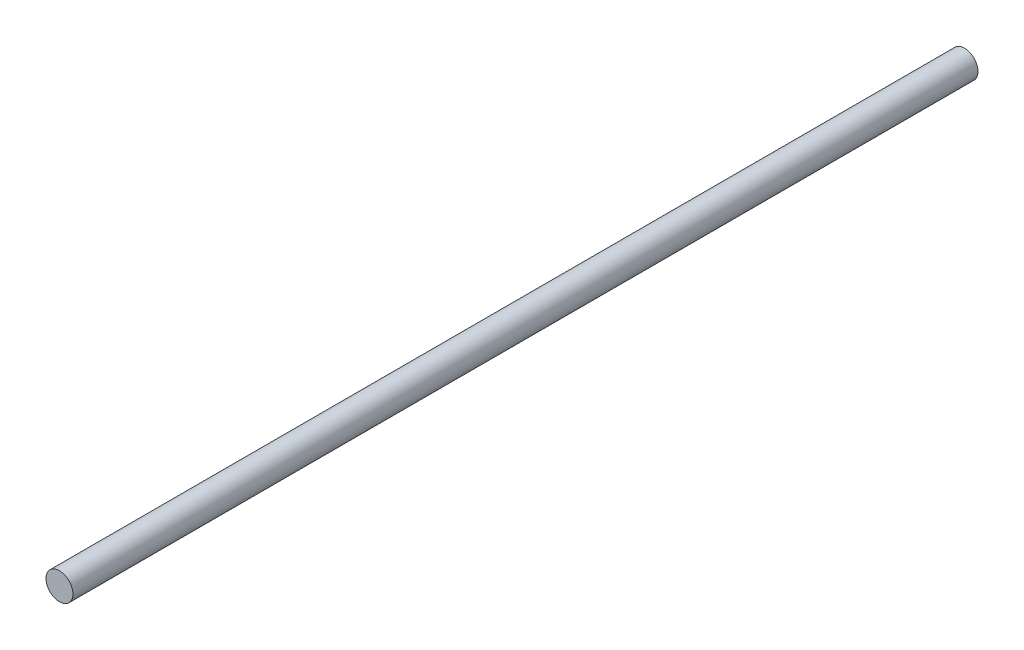
ISO-10303-21;
HEADER;
FILE_DESCRIPTION(('STEP AP214'),'2;1');
FILE_NAME('part.step','',(''),(''),'','','');
FILE_SCHEMA(('AUTOMOTIVE_DESIGN { 1 0 10303 214 1 1 1 1 }'));
ENDSEC;
DATA;
#1=APPLICATION_CONTEXT('core data for automotive mechanical design processes');
#2=APPLICATION_PROTOCOL_DEFINITION('international standard','automotive_design',2000,#1);
#3=PRODUCT_CONTEXT('',#1,'mechanical');
#4=PRODUCT('Part','Part','',(#3));
#5=PRODUCT_RELATED_PRODUCT_CATEGORY('part','',(#4));
#6=PRODUCT_DEFINITION_FORMATION('','',#4);
#7=PRODUCT_DEFINITION_CONTEXT('part definition',#1,'design');
#8=PRODUCT_DEFINITION('design','',#6,#7);
#9=PRODUCT_DEFINITION_SHAPE('','',#8);
#10=(LENGTH_UNIT() NAMED_UNIT(*) SI_UNIT(.MILLI.,.METRE.));
#11=(NAMED_UNIT(*) PLANE_ANGLE_UNIT() SI_UNIT($,.RADIAN.));
#12=(NAMED_UNIT(*) SI_UNIT($,.STERADIAN.) SOLID_ANGLE_UNIT());
#13=UNCERTAINTY_MEASURE_WITH_UNIT(LENGTH_MEASURE(1.E-05),#10,'distance_accuracy_value','');
#14=(GEOMETRIC_REPRESENTATION_CONTEXT(3) GLOBAL_UNCERTAINTY_ASSIGNED_CONTEXT((#13)) GLOBAL_UNIT_ASSIGNED_CONTEXT((#10,
#11,#12)) REPRESENTATION_CONTEXT('',''));
#15=CARTESIAN_POINT('',(0.,0.,0.));
#16=DIRECTION('',(0.,0.,1.));
#17=DIRECTION('',(1.,0.,0.));
#18=AXIS2_PLACEMENT_3D('',#15,#16,#17);
#19=CARTESIAN_POINT('',(0.,0.,-213.106));
#20=DIRECTION('',(0.,0.,1.));
#21=DIRECTION('',(1.,0.,0.));
#22=AXIS2_PLACEMENT_3D('',#19,#20,#21);
#23=CYLINDRICAL_SURFACE('',#22,3.175);
#24=CARTESIAN_POINT('',(0.,0.,-213.106));
#25=DIRECTION('',(0.,0.,1.));
#26=DIRECTION('',(1.,0.,0.));
#27=AXIS2_PLACEMENT_3D('',#24,#25,#26);
#28=CIRCLE('',#27,3.175);
#29=CARTESIAN_POINT('',(3.175,0.,-213.106));
#30=VERTEX_POINT('',#29);
#31=EDGE_CURVE('E10',#30,#30,#28,.T.);
#32=ORIENTED_EDGE('',*,*,#31,.T.);
#33=EDGE_LOOP('',(#32));
#34=FACE_BOUND('',#33,.T.);
#35=CARTESIAN_POINT('',(0.,0.,0.));
#36=DIRECTION('',(0.,0.,1.));
#37=DIRECTION('',(1.,0.,0.));
#38=AXIS2_PLACEMENT_3D('',#35,#36,#37);
#39=CIRCLE('',#38,3.175);
#40=CARTESIAN_POINT('',(3.175,0.,0.));
#41=VERTEX_POINT('',#40);
#42=EDGE_CURVE('E46',#41,#41,#39,.T.);
#43=ORIENTED_EDGE('',*,*,#42,.F.);
#44=EDGE_LOOP('',(#43));
#45=FACE_BOUND('',#44,.T.);
#46=ADVANCED_FACE('F43',(#34,#45),#23,.T.);
#47=CARTESIAN_POINT('',(0.,0.,-213.106));
#48=DIRECTION('',(0.,0.,1.));
#49=DIRECTION('',(1.,0.,0.));
#50=AXIS2_PLACEMENT_3D('',#47,#48,#49);
#51=PLANE('',#50);
#52=ORIENTED_EDGE('',*,*,#31,.F.);
#53=EDGE_LOOP('',(#52));
#54=FACE_BOUND('',#53,.T.);
#55=ADVANCED_FACE('F60',(#54),#51,.F.);
#56=CARTESIAN_POINT('',(0.,0.,0.));
#57=DIRECTION('',(0.,0.,1.));
#58=DIRECTION('',(1.,0.,0.));
#59=AXIS2_PLACEMENT_3D('',#56,#57,#58);
#60=PLANE('',#59);
#61=ORIENTED_EDGE('',*,*,#42,.T.);
#62=EDGE_LOOP('',(#61));
#63=FACE_BOUND('',#62,.T.);
#64=ADVANCED_FACE('F57',(#63),#60,.T.);
#65=CLOSED_SHELL('',(#46,#55,#64));
#66=MANIFOLD_SOLID_BREP('B2',#65);
#67=ADVANCED_BREP_SHAPE_REPRESENTATION('',(#18,#66),#14);
#68=SHAPE_DEFINITION_REPRESENTATION(#9,#67);
ENDSEC;
END-ISO-10303-21;
